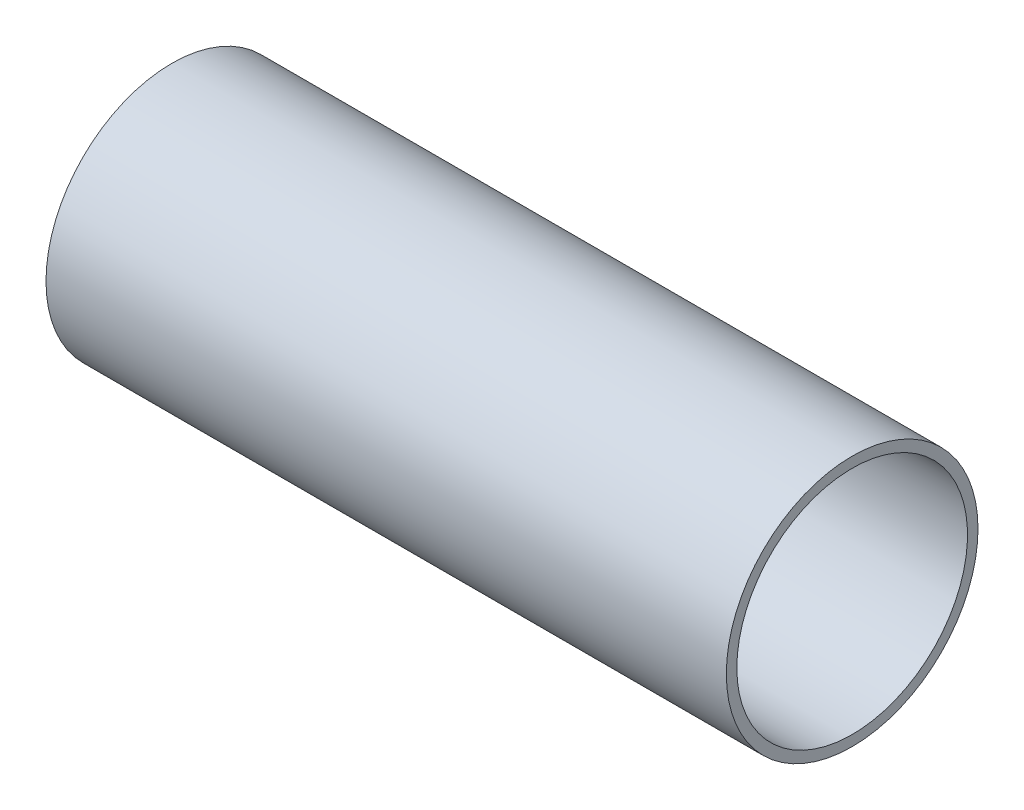
ISO-10303-21;
HEADER;
FILE_DESCRIPTION(('STEP AP214'),'2;1');
FILE_NAME('part.step','',(''),(''),'','','');
FILE_SCHEMA(('AUTOMOTIVE_DESIGN { 1 0 10303 214 1 1 1 1 }'));
ENDSEC;
DATA;
#1=APPLICATION_CONTEXT('core data for automotive mechanical design processes');
#2=APPLICATION_PROTOCOL_DEFINITION('international standard','automotive_design',2000,#1);
#3=PRODUCT_CONTEXT('',#1,'mechanical');
#4=PRODUCT('Part','Part','',(#3));
#5=PRODUCT_RELATED_PRODUCT_CATEGORY('part','',(#4));
#6=PRODUCT_DEFINITION_FORMATION('','',#4);
#7=PRODUCT_DEFINITION_CONTEXT('part definition',#1,'design');
#8=PRODUCT_DEFINITION('design','',#6,#7);
#9=PRODUCT_DEFINITION_SHAPE('','',#8);
#10=(LENGTH_UNIT() NAMED_UNIT(*) SI_UNIT(.MILLI.,.METRE.));
#11=(NAMED_UNIT(*) PLANE_ANGLE_UNIT() SI_UNIT($,.RADIAN.));
#12=(NAMED_UNIT(*) SI_UNIT($,.STERADIAN.) SOLID_ANGLE_UNIT());
#13=UNCERTAINTY_MEASURE_WITH_UNIT(LENGTH_MEASURE(1.E-05),#10,'distance_accuracy_value','');
#14=(GEOMETRIC_REPRESENTATION_CONTEXT(3) GLOBAL_UNCERTAINTY_ASSIGNED_CONTEXT((#13)) GLOBAL_UNIT_ASSIGNED_CONTEXT((#10,
#11,#12)) REPRESENTATION_CONTEXT('',''));
#15=CARTESIAN_POINT('',(0.,0.,0.));
#16=DIRECTION('',(0.,0.,1.));
#17=DIRECTION('',(1.,0.,0.));
#18=AXIS2_PLACEMENT_3D('',#15,#16,#17);
#19=CARTESIAN_POINT('',(-206.,69.8499999999999,0.));
#20=DIRECTION('',(1.,0.,0.));
#21=DIRECTION('',(0.,0.,-1.));
#22=AXIS2_PLACEMENT_3D('',#19,#20,#21);
#23=PLANE('',#22);
#24=CARTESIAN_POINT('',(-206.,0.,0.));
#25=DIRECTION('',(-1.,0.,0.));
#26=DIRECTION('',(0.,0.,1.));
#27=AXIS2_PLACEMENT_3D('',#24,#25,#26);
#28=CIRCLE('',#27,69.8499999999999);
#29=CARTESIAN_POINT('',(-206.,0.,69.8499999999999));
#30=VERTEX_POINT('',#29);
#31=EDGE_CURVE('E55',#30,#30,#28,.T.);
#32=ORIENTED_EDGE('',*,*,#31,.F.);
#33=EDGE_LOOP('',(#32));
#34=FACE_BOUND('',#33,.T.);
#35=CARTESIAN_POINT('',(-206.,0.,0.));
#36=DIRECTION('',(-1.,0.,0.));
#37=DIRECTION('',(0.,0.,1.));
#38=AXIS2_PLACEMENT_3D('',#35,#36,#37);
#39=CIRCLE('',#38,76.2);
#40=CARTESIAN_POINT('',(-206.,0.,76.2));
#41=VERTEX_POINT('',#40);
#42=EDGE_CURVE('E10',#41,#41,#39,.T.);
#43=ORIENTED_EDGE('',*,*,#42,.T.);
#44=EDGE_LOOP('',(#43));
#45=FACE_BOUND('',#44,.T.);
#46=ADVANCED_FACE('F41',(#34,#45),#23,.F.);
#47=CARTESIAN_POINT('',(0.,0.,0.));
#48=DIRECTION('',(-1.,0.,0.));
#49=DIRECTION('',(0.,0.,1.));
#50=AXIS2_PLACEMENT_3D('',#47,#48,#49);
#51=CYLINDRICAL_SURFACE('',#50,76.2);
#52=ORIENTED_EDGE('',*,*,#42,.F.);
#53=EDGE_LOOP('',(#52));
#54=FACE_BOUND('',#53,.T.);
#55=CARTESIAN_POINT('',(206.,0.,0.));
#56=DIRECTION('',(-1.,0.,0.));
#57=DIRECTION('',(0.,0.,1.));
#58=AXIS2_PLACEMENT_3D('',#55,#56,#57);
#59=CIRCLE('',#58,76.2);
#60=CARTESIAN_POINT('',(206.,0.,76.2));
#61=VERTEX_POINT('',#60);
#62=EDGE_CURVE('E47',#61,#61,#59,.T.);
#63=ORIENTED_EDGE('',*,*,#62,.T.);
#64=EDGE_LOOP('',(#63));
#65=FACE_BOUND('',#64,.T.);
#66=ADVANCED_FACE('F64',(#54,#65),#51,.T.);
#67=CARTESIAN_POINT('',(206.,76.2,0.));
#68=DIRECTION('',(-1.,0.,0.));
#69=DIRECTION('',(0.,0.,1.));
#70=AXIS2_PLACEMENT_3D('',#67,#68,#69);
#71=PLANE('',#70);
#72=ORIENTED_EDGE('',*,*,#62,.F.);
#73=EDGE_LOOP('',(#72));
#74=FACE_BOUND('',#73,.T.);
#75=CARTESIAN_POINT('',(206.,0.,0.));
#76=DIRECTION('',(-1.,0.,0.));
#77=DIRECTION('',(0.,0.,1.));
#78=AXIS2_PLACEMENT_3D('',#75,#76,#77);
#79=CIRCLE('',#78,69.8499999999999);
#80=CARTESIAN_POINT('',(206.,0.,69.8499999999999));
#81=VERTEX_POINT('',#80);
#82=EDGE_CURVE('E51',#81,#81,#79,.T.);
#83=ORIENTED_EDGE('',*,*,#82,.T.);
#84=EDGE_LOOP('',(#83));
#85=FACE_BOUND('',#84,.T.);
#86=ADVANCED_FACE('F68',(#74,#85),#71,.F.);
#87=CARTESIAN_POINT('',(0.,0.,0.));
#88=DIRECTION('',(-1.,0.,0.));
#89=DIRECTION('',(0.,0.,1.));
#90=AXIS2_PLACEMENT_3D('',#87,#88,#89);
#91=CYLINDRICAL_SURFACE('',#90,69.8499999999999);
#92=ORIENTED_EDGE('',*,*,#82,.F.);
#93=EDGE_LOOP('',(#92));
#94=FACE_BOUND('',#93,.T.);
#95=ORIENTED_EDGE('',*,*,#31,.T.);
#96=EDGE_LOOP('',(#95));
#97=FACE_BOUND('',#96,.T.);
#98=ADVANCED_FACE('F61',(#94,#97),#91,.F.);
#99=CLOSED_SHELL('',(#46,#66,#86,#98));
#100=MANIFOLD_SOLID_BREP('B2',#99);
#101=ADVANCED_BREP_SHAPE_REPRESENTATION('',(#18,#100),#14);
#102=SHAPE_DEFINITION_REPRESENTATION(#9,#101);
ENDSEC;
END-ISO-10303-21;
